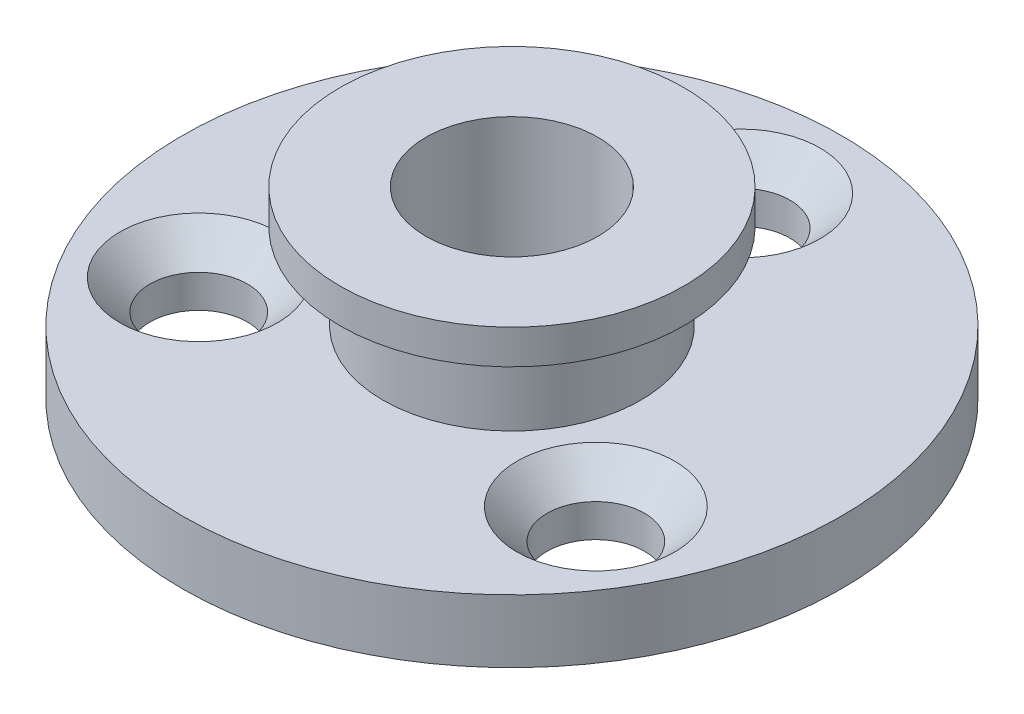
ISO-10303-21;
HEADER;
FILE_DESCRIPTION(('STEP AP214'),'2;1');
FILE_NAME('part.step','',(''),(''),'','','');
FILE_SCHEMA(('AUTOMOTIVE_DESIGN { 1 0 10303 214 1 1 1 1 }'));
ENDSEC;
DATA;
#1=APPLICATION_CONTEXT('core data for automotive mechanical design processes');
#2=APPLICATION_PROTOCOL_DEFINITION('international standard','automotive_design',2000,#1);
#3=PRODUCT_CONTEXT('',#1,'mechanical');
#4=PRODUCT('Part','Part','',(#3));
#5=PRODUCT_RELATED_PRODUCT_CATEGORY('part','',(#4));
#6=PRODUCT_DEFINITION_FORMATION('','',#4);
#7=PRODUCT_DEFINITION_CONTEXT('part definition',#1,'design');
#8=PRODUCT_DEFINITION('design','',#6,#7);
#9=PRODUCT_DEFINITION_SHAPE('','',#8);
#10=(LENGTH_UNIT() NAMED_UNIT(*) SI_UNIT(.MILLI.,.METRE.));
#11=(NAMED_UNIT(*) PLANE_ANGLE_UNIT() SI_UNIT($,.RADIAN.));
#12=(NAMED_UNIT(*) SI_UNIT($,.STERADIAN.) SOLID_ANGLE_UNIT());
#13=UNCERTAINTY_MEASURE_WITH_UNIT(LENGTH_MEASURE(1.E-05),#10,'distance_accuracy_value','');
#14=(GEOMETRIC_REPRESENTATION_CONTEXT(3) GLOBAL_UNCERTAINTY_ASSIGNED_CONTEXT((#13)) GLOBAL_UNIT_ASSIGNED_CONTEXT((#10,
#11,#12)) REPRESENTATION_CONTEXT('',''));
#15=CARTESIAN_POINT('',(0.,0.,0.));
#16=DIRECTION('',(0.,0.,1.));
#17=DIRECTION('',(1.,0.,0.));
#18=AXIS2_PLACEMENT_3D('',#15,#16,#17);
#19=CARTESIAN_POINT('',(11.5,-3.2,0.));
#20=DIRECTION('',(0.,1.,0.));
#21=DIRECTION('',(0.,0.,1.));
#22=AXIS2_PLACEMENT_3D('',#19,#20,#21);
#23=PLANE('',#22);
#24=CARTESIAN_POINT('',(-6.92820323027555,-3.2,3.99999999999994));
#25=DIRECTION('',(0.,1.,0.));
#26=DIRECTION('',(0.,0.,1.));
#27=AXIS2_PLACEMENT_3D('',#24,#25,#26);
#28=CIRCLE('',#27,1.7);
#29=CARTESIAN_POINT('',(-6.92820323027555,-3.2,5.69999999999994));
#30=VERTEX_POINT('',#29);
#31=EDGE_CURVE('E106',#30,#30,#28,.T.);
#32=ORIENTED_EDGE('',*,*,#31,.T.);
#33=EDGE_LOOP('',(#32));
#34=FACE_BOUND('',#33,.T.);
#35=CARTESIAN_POINT('',(6.92820323027549,-3.2,4.00000000000003));
#36=DIRECTION('',(0.,1.,0.));
#37=DIRECTION('',(0.,0.,1.));
#38=AXIS2_PLACEMENT_3D('',#35,#36,#37);
#39=CIRCLE('',#38,1.7);
#40=CARTESIAN_POINT('',(6.92820323027549,-3.2,5.70000000000003));
#41=VERTEX_POINT('',#40);
#42=EDGE_CURVE('E94',#41,#41,#39,.T.);
#43=ORIENTED_EDGE('',*,*,#42,.T.);
#44=EDGE_LOOP('',(#43));
#45=FACE_BOUND('',#44,.T.);
#46=CARTESIAN_POINT('',(0.,-3.2,-8.));
#47=DIRECTION('',(0.,1.,0.));
#48=DIRECTION('',(0.,0.,1.));
#49=AXIS2_PLACEMENT_3D('',#46,#47,#48);
#50=CIRCLE('',#49,1.7);
#51=CARTESIAN_POINT('',(0.,-3.2,-6.3));
#52=VERTEX_POINT('',#51);
#53=EDGE_CURVE('E82',#52,#52,#50,.T.);
#54=ORIENTED_EDGE('',*,*,#53,.T.);
#55=EDGE_LOOP('',(#54));
#56=FACE_BOUND('',#55,.T.);
#57=CARTESIAN_POINT('',(0.,-3.2,0.));
#58=DIRECTION('',(0.,1.,0.));
#59=DIRECTION('',(0.,0.,1.));
#60=AXIS2_PLACEMENT_3D('',#57,#58,#59);
#61=CIRCLE('',#60,11.5);
#62=CARTESIAN_POINT('',(0.,-3.2,11.5));
#63=VERTEX_POINT('',#62);
#64=EDGE_CURVE('E78',#63,#63,#61,.T.);
#65=ORIENTED_EDGE('',*,*,#64,.F.);
#66=EDGE_LOOP('',(#65));
#67=FACE_BOUND('',#66,.T.);
#68=CARTESIAN_POINT('',(0.,-3.2,0.));
#69=DIRECTION('',(0.,1.,0.));
#70=DIRECTION('',(0.,0.,1.));
#71=AXIS2_PLACEMENT_3D('',#68,#69,#70);
#72=CIRCLE('',#71,3.);
#73=CARTESIAN_POINT('',(0.,-3.2,3.));
#74=VERTEX_POINT('',#73);
#75=EDGE_CURVE('E10',#74,#74,#72,.T.);
#76=ORIENTED_EDGE('',*,*,#75,.T.);
#77=EDGE_LOOP('',(#76));
#78=FACE_BOUND('',#77,.T.);
#79=ADVANCED_FACE('F43',(#34,#45,#56,#67,#78),#23,.F.);
#80=CARTESIAN_POINT('',(0.,4.68987341772152,0.));
#81=DIRECTION('',(0.,1.,0.));
#82=DIRECTION('',(0.,0.,1.));
#83=AXIS2_PLACEMENT_3D('',#80,#81,#82);
#84=CYLINDRICAL_SURFACE('',#83,3.);
#85=ORIENTED_EDGE('',*,*,#75,.F.);
#86=EDGE_LOOP('',(#85));
#87=FACE_BOUND('',#86,.T.);
#88=CARTESIAN_POINT('',(0.,3.2,0.));
#89=DIRECTION('',(0.,1.,0.));
#90=DIRECTION('',(0.,0.,1.));
#91=AXIS2_PLACEMENT_3D('',#88,#89,#90);
#92=CIRCLE('',#91,3.);
#93=CARTESIAN_POINT('',(0.,3.2,3.));
#94=VERTEX_POINT('',#93);
#95=EDGE_CURVE('E50',#94,#94,#92,.T.);
#96=ORIENTED_EDGE('',*,*,#95,.T.);
#97=EDGE_LOOP('',(#96));
#98=FACE_BOUND('',#97,.T.);
#99=ADVANCED_FACE('F142',(#87,#98),#84,.F.);
#100=CARTESIAN_POINT('',(3.,3.2,0.));
#101=DIRECTION('',(0.,-1.,0.));
#102=DIRECTION('',(0.,0.,-1.));
#103=AXIS2_PLACEMENT_3D('',#100,#101,#102);
#104=PLANE('',#103);
#105=ORIENTED_EDGE('',*,*,#95,.F.);
#106=EDGE_LOOP('',(#105));
#107=FACE_BOUND('',#106,.T.);
#108=CARTESIAN_POINT('',(0.,3.2,0.));
#109=DIRECTION('',(0.,1.,0.));
#110=DIRECTION('',(0.,0.,1.));
#111=AXIS2_PLACEMENT_3D('',#108,#109,#110);
#112=CIRCLE('',#111,6.);
#113=CARTESIAN_POINT('',(0.,3.2,6.));
#114=VERTEX_POINT('',#113);
#115=EDGE_CURVE('E55',#114,#114,#112,.T.);
#116=ORIENTED_EDGE('',*,*,#115,.T.);
#117=EDGE_LOOP('',(#116));
#118=FACE_BOUND('',#117,.T.);
#119=ADVANCED_FACE('F147',(#107,#118),#104,.F.);
#120=CARTESIAN_POINT('',(0.,4.68987341772152,0.));
#121=DIRECTION('',(0.,1.,0.));
#122=DIRECTION('',(0.,0.,1.));
#123=AXIS2_PLACEMENT_3D('',#120,#121,#122);
#124=CYLINDRICAL_SURFACE('',#123,6.);
#125=ORIENTED_EDGE('',*,*,#115,.F.);
#126=EDGE_LOOP('',(#125));
#127=FACE_BOUND('',#126,.T.);
#128=CARTESIAN_POINT('',(0.,2.,0.));
#129=DIRECTION('',(0.,1.,0.));
#130=DIRECTION('',(0.,0.,1.));
#131=AXIS2_PLACEMENT_3D('',#128,#129,#130);
#132=CIRCLE('',#131,6.);
#133=CARTESIAN_POINT('',(0.,2.,6.));
#134=VERTEX_POINT('',#133);
#135=EDGE_CURVE('E60',#134,#134,#132,.T.);
#136=ORIENTED_EDGE('',*,*,#135,.T.);
#137=EDGE_LOOP('',(#136));
#138=FACE_BOUND('',#137,.T.);
#139=ADVANCED_FACE('F179',(#127,#138),#124,.T.);
#140=CARTESIAN_POINT('',(6.,2.,0.));
#141=DIRECTION('',(0.,1.,0.));
#142=DIRECTION('',(0.,0.,1.));
#143=AXIS2_PLACEMENT_3D('',#140,#141,#142);
#144=PLANE('',#143);
#145=ORIENTED_EDGE('',*,*,#135,.F.);
#146=EDGE_LOOP('',(#145));
#147=FACE_BOUND('',#146,.T.);
#148=CARTESIAN_POINT('',(0.,2.,0.));
#149=DIRECTION('',(0.,1.,0.));
#150=DIRECTION('',(0.,0.,1.));
#151=AXIS2_PLACEMENT_3D('',#148,#149,#150);
#152=CIRCLE('',#151,4.5);
#153=CARTESIAN_POINT('',(0.,2.,4.5));
#154=VERTEX_POINT('',#153);
#155=EDGE_CURVE('E66',#154,#154,#152,.T.);
#156=ORIENTED_EDGE('',*,*,#155,.T.);
#157=EDGE_LOOP('',(#156));
#158=FACE_BOUND('',#157,.T.);
#159=ADVANCED_FACE('F175',(#147,#158),#144,.F.);
#160=CARTESIAN_POINT('',(0.,4.68987341772152,0.));
#161=DIRECTION('',(0.,1.,0.));
#162=DIRECTION('',(0.,0.,1.));
#163=AXIS2_PLACEMENT_3D('',#160,#161,#162);
#164=CYLINDRICAL_SURFACE('',#163,4.5);
#165=ORIENTED_EDGE('',*,*,#155,.F.);
#166=EDGE_LOOP('',(#165));
#167=FACE_BOUND('',#166,.T.);
#168=CARTESIAN_POINT('',(0.,-1.,0.));
#169=DIRECTION('',(0.,1.,0.));
#170=DIRECTION('',(0.,0.,1.));
#171=AXIS2_PLACEMENT_3D('',#168,#169,#170);
#172=CIRCLE('',#171,4.5);
#173=CARTESIAN_POINT('',(0.,-1.,4.5));
#174=VERTEX_POINT('',#173);
#175=EDGE_CURVE('E70',#174,#174,#172,.T.);
#176=ORIENTED_EDGE('',*,*,#175,.T.);
#177=EDGE_LOOP('',(#176));
#178=FACE_BOUND('',#177,.T.);
#179=ADVANCED_FACE('F125',(#167,#178),#164,.T.);
#180=CARTESIAN_POINT('',(4.5,-1.,0.));
#181=DIRECTION('',(0.,-1.,0.));
#182=DIRECTION('',(0.,0.,-1.));
#183=AXIS2_PLACEMENT_3D('',#180,#181,#182);
#184=PLANE('',#183);
#185=CARTESIAN_POINT('',(-6.92820323027555,-1.,3.99999999999994));
#186=DIRECTION('',(0.,1.,0.));
#187=DIRECTION('',(0.,0.,1.));
#188=AXIS2_PLACEMENT_3D('',#185,#186,#187);
#189=CIRCLE('',#188,2.75);
#190=CARTESIAN_POINT('',(-6.92820323027555,-1.,6.74999999999994));
#191=VERTEX_POINT('',#190);
#192=EDGE_CURVE('E114',#191,#191,#189,.T.);
#193=ORIENTED_EDGE('',*,*,#192,.F.);
#194=EDGE_LOOP('',(#193));
#195=FACE_BOUND('',#194,.T.);
#196=CARTESIAN_POINT('',(6.92820323027549,-1.,4.00000000000003));
#197=DIRECTION('',(0.,1.,0.));
#198=DIRECTION('',(0.,0.,1.));
#199=AXIS2_PLACEMENT_3D('',#196,#197,#198);
#200=CIRCLE('',#199,2.75);
#201=CARTESIAN_POINT('',(6.92820323027549,-1.,6.75000000000003));
#202=VERTEX_POINT('',#201);
#203=EDGE_CURVE('E102',#202,#202,#200,.T.);
#204=ORIENTED_EDGE('',*,*,#203,.F.);
#205=EDGE_LOOP('',(#204));
#206=FACE_BOUND('',#205,.T.);
#207=CARTESIAN_POINT('',(0.,-1.,-8.));
#208=DIRECTION('',(0.,1.,0.));
#209=DIRECTION('',(0.,0.,1.));
#210=AXIS2_PLACEMENT_3D('',#207,#208,#209);
#211=CIRCLE('',#210,2.75);
#212=CARTESIAN_POINT('',(0.,-1.,-5.25));
#213=VERTEX_POINT('',#212);
#214=EDGE_CURVE('E90',#213,#213,#211,.T.);
#215=ORIENTED_EDGE('',*,*,#214,.F.);
#216=EDGE_LOOP('',(#215));
#217=FACE_BOUND('',#216,.T.);
#218=ORIENTED_EDGE('',*,*,#175,.F.);
#219=EDGE_LOOP('',(#218));
#220=FACE_BOUND('',#219,.T.);
#221=CARTESIAN_POINT('',(0.,-1.,0.));
#222=DIRECTION('',(0.,1.,0.));
#223=DIRECTION('',(0.,0.,1.));
#224=AXIS2_PLACEMENT_3D('',#221,#222,#223);
#225=CIRCLE('',#224,11.5);
#226=CARTESIAN_POINT('',(0.,-1.,11.5));
#227=VERTEX_POINT('',#226);
#228=EDGE_CURVE('E74',#227,#227,#225,.T.);
#229=ORIENTED_EDGE('',*,*,#228,.T.);
#230=EDGE_LOOP('',(#229));
#231=FACE_BOUND('',#230,.T.);
#232=ADVANCED_FACE('F121',(#195,#206,#217,#220,#231),#184,.F.);
#233=CARTESIAN_POINT('',(0.,4.68987341772152,0.));
#234=DIRECTION('',(0.,1.,0.));
#235=DIRECTION('',(0.,0.,1.));
#236=AXIS2_PLACEMENT_3D('',#233,#234,#235);
#237=CYLINDRICAL_SURFACE('',#236,11.5);
#238=ORIENTED_EDGE('',*,*,#228,.F.);
#239=EDGE_LOOP('',(#238));
#240=FACE_BOUND('',#239,.T.);
#241=ORIENTED_EDGE('',*,*,#64,.T.);
#242=EDGE_LOOP('',(#241));
#243=FACE_BOUND('',#242,.T.);
#244=ADVANCED_FACE('F124',(#240,#243),#237,.T.);
#245=CARTESIAN_POINT('',(0.,-1.,-8.));
#246=DIRECTION('',(0.,1.,0.));
#247=DIRECTION('',(0.,0.,1.));
#248=AXIS2_PLACEMENT_3D('',#245,#246,#247);
#249=CYLINDRICAL_SURFACE('',#248,1.7);
#250=ORIENTED_EDGE('',*,*,#53,.F.);
#251=EDGE_LOOP('',(#250));
#252=FACE_BOUND('',#251,.T.);
#253=CARTESIAN_POINT('',(0.,-2.05,-8.));
#254=DIRECTION('',(0.,1.,0.));
#255=DIRECTION('',(0.,0.,1.));
#256=AXIS2_PLACEMENT_3D('',#253,#254,#255);
#257=CIRCLE('',#256,1.7);
#258=CARTESIAN_POINT('',(0.,-2.05,-6.3));
#259=VERTEX_POINT('',#258);
#260=EDGE_CURVE('E86',#259,#259,#257,.T.);
#261=ORIENTED_EDGE('',*,*,#260,.T.);
#262=EDGE_LOOP('',(#261));
#263=FACE_BOUND('',#262,.T.);
#264=ADVANCED_FACE('F137',(#252,#263),#249,.F.);
#265=CARTESIAN_POINT('',(0.,-1.,-8.));
#266=DIRECTION('',(0.,1.,0.));
#267=DIRECTION('',(0.,0.,1.));
#268=AXIS2_PLACEMENT_3D('',#265,#266,#267);
#269=CONICAL_SURFACE('',#268,2.75,0.785398163397449);
#270=ORIENTED_EDGE('',*,*,#260,.F.);
#271=EDGE_LOOP('',(#270));
#272=FACE_BOUND('',#271,.T.);
#273=ORIENTED_EDGE('',*,*,#214,.T.);
#274=EDGE_LOOP('',(#273));
#275=FACE_BOUND('',#274,.T.);
#276=ADVANCED_FACE('F157',(#272,#275),#269,.F.);
#277=CARTESIAN_POINT('',(6.92820323027549,-1.,4.00000000000003));
#278=DIRECTION('',(0.,1.,0.));
#279=DIRECTION('',(0.,0.,1.));
#280=AXIS2_PLACEMENT_3D('',#277,#278,#279);
#281=CYLINDRICAL_SURFACE('',#280,1.7);
#282=ORIENTED_EDGE('',*,*,#42,.F.);
#283=EDGE_LOOP('',(#282));
#284=FACE_BOUND('',#283,.T.);
#285=CARTESIAN_POINT('',(6.92820323027549,-2.05,4.00000000000003));
#286=DIRECTION('',(0.,1.,0.));
#287=DIRECTION('',(0.,0.,1.));
#288=AXIS2_PLACEMENT_3D('',#285,#286,#287);
#289=CIRCLE('',#288,1.7);
#290=CARTESIAN_POINT('',(6.92820323027549,-2.05,5.70000000000003));
#291=VERTEX_POINT('',#290);
#292=EDGE_CURVE('E98',#291,#291,#289,.T.);
#293=ORIENTED_EDGE('',*,*,#292,.T.);
#294=EDGE_LOOP('',(#293));
#295=FACE_BOUND('',#294,.T.);
#296=ADVANCED_FACE('F163',(#284,#295),#281,.F.);
#297=CARTESIAN_POINT('',(6.92820323027549,-1.,4.00000000000003));
#298=DIRECTION('',(0.,1.,0.));
#299=DIRECTION('',(0.,0.,1.));
#300=AXIS2_PLACEMENT_3D('',#297,#298,#299);
#301=CONICAL_SURFACE('',#300,2.75,0.785398163397449);
#302=ORIENTED_EDGE('',*,*,#292,.F.);
#303=EDGE_LOOP('',(#302));
#304=FACE_BOUND('',#303,.T.);
#305=ORIENTED_EDGE('',*,*,#203,.T.);
#306=EDGE_LOOP('',(#305));
#307=FACE_BOUND('',#306,.T.);
#308=ADVANCED_FACE('F168',(#304,#307),#301,.F.);
#309=CARTESIAN_POINT('',(-6.92820323027555,-1.,3.99999999999994));
#310=DIRECTION('',(0.,1.,0.));
#311=DIRECTION('',(0.,0.,1.));
#312=AXIS2_PLACEMENT_3D('',#309,#310,#311);
#313=CYLINDRICAL_SURFACE('',#312,1.7);
#314=ORIENTED_EDGE('',*,*,#31,.F.);
#315=EDGE_LOOP('',(#314));
#316=FACE_BOUND('',#315,.T.);
#317=CARTESIAN_POINT('',(-6.92820323027555,-2.05,3.99999999999994));
#318=DIRECTION('',(0.,1.,0.));
#319=DIRECTION('',(0.,0.,1.));
#320=AXIS2_PLACEMENT_3D('',#317,#318,#319);
#321=CIRCLE('',#320,1.7);
#322=CARTESIAN_POINT('',(-6.92820323027555,-2.05,5.69999999999994));
#323=VERTEX_POINT('',#322);
#324=EDGE_CURVE('E110',#323,#323,#321,.T.);
#325=ORIENTED_EDGE('',*,*,#324,.T.);
#326=EDGE_LOOP('',(#325));
#327=FACE_BOUND('',#326,.T.);
#328=ADVANCED_FACE('F247',(#316,#327),#313,.F.);
#329=CARTESIAN_POINT('',(-6.92820323027555,-1.,3.99999999999994));
#330=DIRECTION('',(0.,1.,0.));
#331=DIRECTION('',(0.,0.,1.));
#332=AXIS2_PLACEMENT_3D('',#329,#330,#331);
#333=CONICAL_SURFACE('',#332,2.75,0.785398163397449);
#334=ORIENTED_EDGE('',*,*,#324,.F.);
#335=EDGE_LOOP('',(#334));
#336=FACE_BOUND('',#335,.T.);
#337=ORIENTED_EDGE('',*,*,#192,.T.);
#338=EDGE_LOOP('',(#337));
#339=FACE_BOUND('',#338,.T.);
#340=ADVANCED_FACE('F119',(#336,#339),#333,.F.);
#341=CLOSED_SHELL('',(#79,#99,#119,#139,#159,#179,#232,#244,#264,#276,#296,#308,#328,#340));
#342=MANIFOLD_SOLID_BREP('B2',#341);
#343=ADVANCED_BREP_SHAPE_REPRESENTATION('',(#18,#342),#14);
#344=SHAPE_DEFINITION_REPRESENTATION(#9,#343);
ENDSEC;
END-ISO-10303-21;
